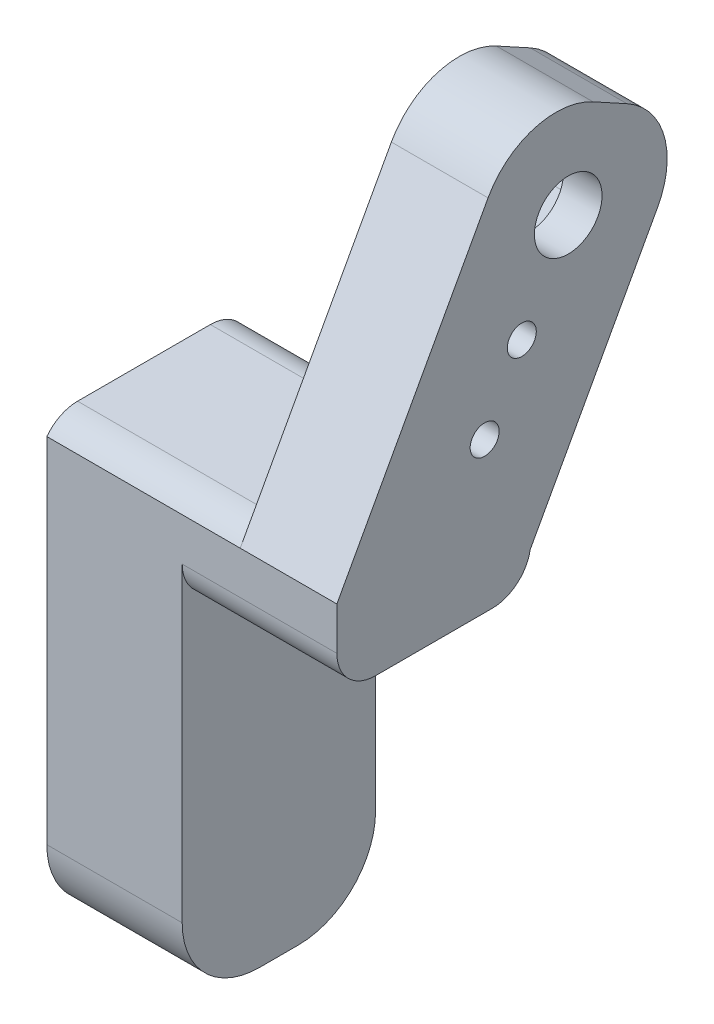
ISO-10303-21;
HEADER;
FILE_DESCRIPTION(('STEP AP214'),'2;1');
FILE_NAME('part.step','',(''),(''),'','','');
FILE_SCHEMA(('AUTOMOTIVE_DESIGN { 1 0 10303 214 1 1 1 1 }'));
ENDSEC;
DATA;
#1=APPLICATION_CONTEXT('core data for automotive mechanical design processes');
#2=APPLICATION_PROTOCOL_DEFINITION('international standard','automotive_design',2000,#1);
#3=PRODUCT_CONTEXT('',#1,'mechanical');
#4=PRODUCT('Part','Part','',(#3));
#5=PRODUCT_RELATED_PRODUCT_CATEGORY('part','',(#4));
#6=PRODUCT_DEFINITION_FORMATION('','',#4);
#7=PRODUCT_DEFINITION_CONTEXT('part definition',#1,'design');
#8=PRODUCT_DEFINITION('design','',#6,#7);
#9=PRODUCT_DEFINITION_SHAPE('','',#8);
#10=(LENGTH_UNIT() NAMED_UNIT(*) SI_UNIT(.MILLI.,.METRE.));
#11=(NAMED_UNIT(*) PLANE_ANGLE_UNIT() SI_UNIT($,.RADIAN.));
#12=(NAMED_UNIT(*) SI_UNIT($,.STERADIAN.) SOLID_ANGLE_UNIT());
#13=UNCERTAINTY_MEASURE_WITH_UNIT(LENGTH_MEASURE(1.E-05),#10,'distance_accuracy_value','');
#14=(GEOMETRIC_REPRESENTATION_CONTEXT(3) GLOBAL_UNCERTAINTY_ASSIGNED_CONTEXT((#13)) GLOBAL_UNIT_ASSIGNED_CONTEXT((#10,
#11,#12)) REPRESENTATION_CONTEXT('',''));
#15=CARTESIAN_POINT('',(0.,0.,0.));
#16=DIRECTION('',(0.,0.,1.));
#17=DIRECTION('',(1.,0.,0.));
#18=AXIS2_PLACEMENT_3D('',#15,#16,#17);
#19=CARTESIAN_POINT('',(15.,-16.6656905459587,14.1244045628382));
#20=DIRECTION('',(0.,0.,-1.));
#21=DIRECTION('',(0.,1.,0.));
#22=AXIS2_PLACEMENT_3D('',#19,#20,#21);
#23=PLANE('',#22);
#24=DIRECTION('',(0.,1.,0.));
#25=VECTOR('',#24,1.);
#26=CARTESIAN_POINT('',(7.,-37.6656905459587,14.1244045628382));
#27=LINE('',#26,#25);
#28=CARTESIAN_POINT('',(7.,-33.6656905459587,14.1244045628382));
#29=VERTEX_POINT('',#28);
#30=CARTESIAN_POINT('',(7.,-17.5988409045163,14.1244045628382));
#31=VERTEX_POINT('',#30);
#32=EDGE_CURVE('E229',#29,#31,#27,.T.);
#33=ORIENTED_EDGE('',*,*,#32,.T.);
#34=DIRECTION('',(1.,0.,0.));
#35=VECTOR('',#34,1.);
#36=CARTESIAN_POINT('',(15.,-17.5988409045163,14.1244045628382));
#37=LINE('',#36,#35);
#38=CARTESIAN_POINT('',(15.,-17.5988409045163,14.1244045628382));
#39=VERTEX_POINT('',#38);
#40=EDGE_CURVE('E335',#31,#39,#37,.T.);
#41=ORIENTED_EDGE('',*,*,#40,.T.);
#42=DIRECTION('',(0.,-1.,0.));
#43=VECTOR('',#42,1.);
#44=CARTESIAN_POINT('',(15.,-16.6656905459587,14.1244045628382));
#45=LINE('',#44,#43);
#46=CARTESIAN_POINT('',(15.,-15.3865334031746,14.1244045628382));
#47=VERTEX_POINT('',#46);
#48=EDGE_CURVE('E251',#47,#39,#45,.T.);
#49=ORIENTED_EDGE('',*,*,#48,.F.);
#50=DIRECTION('',(-1.,0.,0.));
#51=VECTOR('',#50,1.);
#52=CARTESIAN_POINT('',(15.,-15.3865334031746,14.1244045628382));
#53=LINE('',#52,#51);
#54=CARTESIAN_POINT('',(10.,-15.3865334031746,14.1244045628382));
#55=VERTEX_POINT('',#54);
#56=EDGE_CURVE('E273',#47,#55,#53,.T.);
#57=ORIENTED_EDGE('',*,*,#56,.T.);
#58=CARTESIAN_POINT('',(0.,-15.3865334031746,14.1244045628382));
#59=VERTEX_POINT('',#58);
#60=EDGE_CURVE('E263',#55,#59,#53,.T.);
#61=ORIENTED_EDGE('',*,*,#60,.T.);
#62=DIRECTION('',(0.,-1.,0.));
#63=VECTOR('',#62,1.);
#64=CARTESIAN_POINT('',(0.,-16.6656905459587,14.1244045628382));
#65=LINE('',#64,#63);
#66=CARTESIAN_POINT('',(0.,-33.6656905459587,14.1244045628382));
#67=VERTEX_POINT('',#66);
#68=EDGE_CURVE('E250',#59,#67,#65,.T.);
#69=ORIENTED_EDGE('',*,*,#68,.T.);
#70=DIRECTION('',(-1.,0.,0.));
#71=VECTOR('',#70,1.);
#72=CARTESIAN_POINT('',(7.,-33.6656905459587,14.1244045628382));
#73=LINE('',#72,#71);
#74=EDGE_CURVE('E301',#67,#29,#73,.F.);
#75=ORIENTED_EDGE('',*,*,#74,.T.);
#76=EDGE_LOOP('',(#33,#41,#49,#57,#61,#69,#75));
#77=FACE_BOUND('',#76,.T.);
#78=ADVANCED_FACE('F35',(#77),#23,.F.);
#79=CARTESIAN_POINT('',(15.,-37.6656905459587,4.12440456283817));
#80=DIRECTION('',(0.,-1.,0.));
#81=DIRECTION('',(0.,0.,-1.));
#82=AXIS2_PLACEMENT_3D('',#79,#80,#81);
#83=PLANE('',#82);
#84=DIRECTION('',(0.,0.,1.));
#85=VECTOR('',#84,1.);
#86=CARTESIAN_POINT('',(7.,-37.6656905459587,-4.38570803841019));
#87=LINE('',#86,#85);
#88=CARTESIAN_POINT('',(7.,-37.6656905459587,8.12440456283817));
#89=VERTEX_POINT('',#88);
#90=CARTESIAN_POINT('',(7.,-37.6656905459587,10.1244045628382));
#91=VERTEX_POINT('',#90);
#92=EDGE_CURVE('E240',#89,#91,#87,.T.);
#93=ORIENTED_EDGE('',*,*,#92,.T.);
#94=DIRECTION('',(-1.,0.,0.));
#95=VECTOR('',#94,1.);
#96=CARTESIAN_POINT('',(0.,-37.6656905459587,10.1244045628382));
#97=LINE('',#96,#95);
#98=CARTESIAN_POINT('',(0.,-37.6656905459587,10.1244045628382));
#99=VERTEX_POINT('',#98);
#100=EDGE_CURVE('E294',#91,#99,#97,.T.);
#101=ORIENTED_EDGE('',*,*,#100,.T.);
#102=DIRECTION('',(0.,0.,1.));
#103=VECTOR('',#102,1.);
#104=CARTESIAN_POINT('',(0.,-37.6656905459587,4.12440456283817));
#105=LINE('',#104,#103);
#106=CARTESIAN_POINT('',(0.,-37.6656905459587,8.12440456283817));
#107=VERTEX_POINT('',#106);
#108=EDGE_CURVE('E266',#107,#99,#105,.T.);
#109=ORIENTED_EDGE('',*,*,#108,.F.);
#110=DIRECTION('',(-1.,0.,0.));
#111=VECTOR('',#110,1.);
#112=CARTESIAN_POINT('',(15.,-37.6656905459587,8.12440456283817));
#113=LINE('',#112,#111);
#114=EDGE_CURVE('E292',#107,#89,#113,.F.);
#115=ORIENTED_EDGE('',*,*,#114,.T.);
#116=EDGE_LOOP('',(#93,#101,#109,#115));
#117=FACE_BOUND('',#116,.T.);
#118=ADVANCED_FACE('F391',(#117),#83,.T.);
#119=CARTESIAN_POINT('',(15.,-16.6656905459587,4.12440456283817));
#120=DIRECTION('',(0.,0.,-1.));
#121=DIRECTION('',(0.,1.,0.));
#122=AXIS2_PLACEMENT_3D('',#119,#120,#121);
#123=PLANE('',#122);
#124=DIRECTION('',(-1.,0.,0.));
#125=VECTOR('',#124,1.);
#126=CARTESIAN_POINT('',(15.,-17.9448476887428,4.12440456283817));
#127=LINE('',#126,#125);
#128=CARTESIAN_POINT('',(7.,-17.9448476887428,4.12440456283817));
#129=VERTEX_POINT('',#128);
#130=CARTESIAN_POINT('',(0.,-17.9448476887428,4.12440456283817));
#131=VERTEX_POINT('',#130);
#132=EDGE_CURVE('E276',#129,#131,#127,.T.);
#133=ORIENTED_EDGE('',*,*,#132,.F.);
#134=DIRECTION('',(0.,-1.,0.));
#135=VECTOR('',#134,1.);
#136=CARTESIAN_POINT('',(7.,-16.6656905459587,4.12440456283817));
#137=LINE('',#136,#135);
#138=CARTESIAN_POINT('',(7.,-33.6656905459587,4.12440456283817));
#139=VERTEX_POINT('',#138);
#140=EDGE_CURVE('E287',#129,#139,#137,.T.);
#141=ORIENTED_EDGE('',*,*,#140,.T.);
#142=DIRECTION('',(-1.,0.,0.));
#143=VECTOR('',#142,1.);
#144=CARTESIAN_POINT('',(15.,-33.6656905459587,4.12440456283817));
#145=LINE('',#144,#143);
#146=CARTESIAN_POINT('',(0.,-33.6656905459587,4.12440456283817));
#147=VERTEX_POINT('',#146);
#148=EDGE_CURVE('E307',#139,#147,#145,.T.);
#149=ORIENTED_EDGE('',*,*,#148,.T.);
#150=DIRECTION('',(0.,-1.,0.));
#151=VECTOR('',#150,1.);
#152=CARTESIAN_POINT('',(0.,-16.6656905459587,4.12440456283817));
#153=LINE('',#152,#151);
#154=EDGE_CURVE('E269',#131,#147,#153,.T.);
#155=ORIENTED_EDGE('',*,*,#154,.F.);
#156=EDGE_LOOP('',(#133,#141,#149,#155));
#157=FACE_BOUND('',#156,.T.);
#158=ADVANCED_FACE('F385',(#157),#123,.T.);
#159=CARTESIAN_POINT('',(15.,-2.40115909548373,-4.38570803841019));
#160=DIRECTION('',(0.,-0.480231819096746,-0.877141607682038));
#161=DIRECTION('',(0.,0.877141607682038,-0.480231819096746));
#162=AXIS2_PLACEMENT_3D('',#159,#160,#161);
#163=PLANE('',#162);
#164=DIRECTION('',(0.,-0.877141607682038,0.480231819096746));
#165=VECTOR('',#164,1.);
#166=CARTESIAN_POINT('',(0.,-2.40115909548373,-4.38570803841019));
#167=LINE('',#166,#165);
#168=CARTESIAN_POINT('',(0.,-17.5593045427098,3.91332110181182));
#169=VERTEX_POINT('',#168);
#170=EDGE_CURVE('E255',#169,#131,#167,.T.);
#171=ORIENTED_EDGE('',*,*,#170,.F.);
#172=DIRECTION('',(1.,0.,0.));
#173=VECTOR('',#172,1.);
#174=CARTESIAN_POINT('',(15.,-17.5593045427098,3.91332110181182));
#175=LINE('',#174,#173);
#176=CARTESIAN_POINT('',(10.,-17.5593045427098,3.91332110181182));
#177=VERTEX_POINT('',#176);
#178=EDGE_CURVE('E343',#169,#177,#175,.T.);
#179=ORIENTED_EDGE('',*,*,#178,.T.);
#180=DIRECTION('',(0.,0.877141607682038,-0.480231819096746));
#181=VECTOR('',#180,1.);
#182=CARTESIAN_POINT('',(10.,-2.40115909548373,-4.38570803841019));
#183=LINE('',#182,#181);
#184=CARTESIAN_POINT('',(10.,-5.90972552621188,-2.46478076202321));
#185=VERTEX_POINT('',#184);
#186=EDGE_CURVE('E247',#177,#185,#183,.T.);
#187=ORIENTED_EDGE('',*,*,#186,.T.);
#188=DIRECTION('',(-1.,0.,0.));
#189=VECTOR('',#188,1.);
#190=CARTESIAN_POINT('',(15.,-5.90972552621188,-2.46478076202321));
#191=LINE('',#190,#189);
#192=CARTESIAN_POINT('',(15.,-5.90972552621188,-2.46478076202321));
#193=VERTEX_POINT('',#192);
#194=EDGE_CURVE('E319',#185,#193,#191,.F.);
#195=ORIENTED_EDGE('',*,*,#194,.T.);
#196=DIRECTION('',(0.,-0.877141607682038,0.480231819096746));
#197=VECTOR('',#196,1.);
#198=CARTESIAN_POINT('',(15.,-2.40115909548373,-4.38570803841019));
#199=LINE('',#198,#197);
#200=CARTESIAN_POINT('',(15.,-17.9448476887428,4.12440456283817));
#201=VERTEX_POINT('',#200);
#202=EDGE_CURVE('E254',#193,#201,#199,.T.);
#203=ORIENTED_EDGE('',*,*,#202,.T.);
#204=EDGE_CURVE('E277',#201,#129,#127,.T.);
#205=ORIENTED_EDGE('',*,*,#204,.T.);
#206=ORIENTED_EDGE('',*,*,#132,.T.);
#207=EDGE_LOOP('',(#171,#179,#187,#195,#203,#205,#206));
#208=FACE_BOUND('',#207,.T.);
#209=ADVANCED_FACE('F380',(#208),#163,.T.);
#210=CARTESIAN_POINT('',(15.,2.40115909548373,4.38570803841019));
#211=DIRECTION('',(0.,0.877141607682038,-0.480231819096746));
#212=DIRECTION('',(0.,0.480231819096746,0.877141607682038));
#213=AXIS2_PLACEMENT_3D('',#210,#211,#212);
#214=PLANE('',#213);
#215=DIRECTION('',(0.,-0.480231819096746,-0.877141607682038));
#216=VECTOR('',#215,1.);
#217=CARTESIAN_POINT('',(15.,2.40115909548373,4.38570803841019));
#218=LINE('',#217,#216);
#219=CARTESIAN_POINT('',(15.,0.480231819096746,0.877141607682038));
#220=VERTEX_POINT('',#219);
#221=CARTESIAN_POINT('',(15.,-0.480231819096747,-0.87714160768204));
#222=VERTEX_POINT('',#221);
#223=EDGE_CURVE('E258',#220,#222,#218,.T.);
#224=ORIENTED_EDGE('',*,*,#223,.T.);
#225=DIRECTION('',(-1.,0.,0.));
#226=VECTOR('',#225,1.);
#227=CARTESIAN_POINT('',(15.,-0.480231819096746,-0.877141607682038));
#228=LINE('',#227,#226);
#229=CARTESIAN_POINT('',(10.,-0.480231819096746,-0.877141607682038));
#230=VERTEX_POINT('',#229);
#231=EDGE_CURVE('E312',#222,#230,#228,.T.);
#232=ORIENTED_EDGE('',*,*,#231,.T.);
#233=DIRECTION('',(0.,0.480231819096746,0.877141607682038));
#234=VECTOR('',#233,1.);
#235=CARTESIAN_POINT('',(10.,2.40115909548373,4.38570803841019));
#236=LINE('',#235,#234);
#237=CARTESIAN_POINT('',(10.,0.480231819096746,0.877141607682039));
#238=VERTEX_POINT('',#237);
#239=EDGE_CURVE('E239',#230,#238,#236,.T.);
#240=ORIENTED_EDGE('',*,*,#239,.T.);
#241=DIRECTION('',(-1.,0.,0.));
#242=VECTOR('',#241,1.);
#243=CARTESIAN_POINT('',(15.,0.480231819096746,0.877141607682039));
#244=LINE('',#243,#242);
#245=EDGE_CURVE('E310',#238,#220,#244,.F.);
#246=ORIENTED_EDGE('',*,*,#245,.T.);
#247=EDGE_LOOP('',(#224,#232,#240,#246));
#248=FACE_BOUND('',#247,.T.);
#249=ADVANCED_FACE('F460',(#248),#214,.T.);
#250=CARTESIAN_POINT('',(15.,2.40115909548373,4.38570803841019));
#251=DIRECTION('',(0.,-0.480231819096746,-0.877141607682038));
#252=DIRECTION('',(0.,0.877141607682038,-0.480231819096746));
#253=AXIS2_PLACEMENT_3D('',#250,#251,#252);
#254=PLANE('',#253);
#255=DIRECTION('',(0.,0.877141607682038,-0.480231819096746));
#256=VECTOR('',#255,1.);
#257=CARTESIAN_POINT('',(10.,2.40115909548373,4.38570803841019));
#258=LINE('',#257,#256);
#259=CARTESIAN_POINT('',(10.,-1.10740733524442,6.30663531479717));
#260=VERTEX_POINT('',#259);
#261=EDGE_CURVE('E50',#55,#260,#258,.T.);
#262=ORIENTED_EDGE('',*,*,#261,.F.);
#263=ORIENTED_EDGE('',*,*,#56,.F.);
#264=DIRECTION('',(0.,-0.877141607682038,0.480231819096746));
#265=VECTOR('',#264,1.);
#266=CARTESIAN_POINT('',(15.,2.40115909548373,4.38570803841019));
#267=LINE('',#266,#265);
#268=CARTESIAN_POINT('',(15.,-1.10740733524442,6.30663531479717));
#269=VERTEX_POINT('',#268);
#270=EDGE_CURVE('E261',#269,#47,#267,.T.);
#271=ORIENTED_EDGE('',*,*,#270,.F.);
#272=DIRECTION('',(-1.,0.,0.));
#273=VECTOR('',#272,1.);
#274=CARTESIAN_POINT('',(10.,-1.10740733524442,6.30663531479717));
#275=LINE('',#274,#273);
#276=EDGE_CURVE('E325',#269,#260,#275,.T.);
#277=ORIENTED_EDGE('',*,*,#276,.T.);
#278=EDGE_LOOP('',(#262,#263,#271,#277));
#279=FACE_BOUND('',#278,.T.);
#280=ADVANCED_FACE('F464',(#279),#254,.F.);
#281=CARTESIAN_POINT('',(15.,0.,0.));
#282=DIRECTION('',(-1.,0.,0.));
#283=DIRECTION('',(0.,0.,1.));
#284=AXIS2_PLACEMENT_3D('',#281,#282,#283);
#285=PLANE('',#284);
#286=CARTESIAN_POINT('',(15.,-3.94713723456917,2.16104318593536));
#287=DIRECTION('',(-1.,0.,0.));
#288=DIRECTION('',(0.,-1.,0.));
#289=AXIS2_PLACEMENT_3D('',#286,#287,#288);
#290=CIRCLE('',#289,1.75);
#291=CARTESIAN_POINT('',(15.,-5.69713723456917,2.16104318593536));
#292=VERTEX_POINT('',#291);
#293=EDGE_CURVE('E222',#292,#292,#290,.T.);
#294=ORIENTED_EDGE('',*,*,#293,.T.);
#295=EDGE_LOOP('',(#294));
#296=FACE_BOUND('',#295,.T.);
#297=CARTESIAN_POINT('',(15.,-11.8414117037075,6.48312955780607));
#298=DIRECTION('',(-1.,0.,0.));
#299=DIRECTION('',(0.,-1.,0.));
#300=AXIS2_PLACEMENT_3D('',#297,#298,#299);
#301=CIRCLE('',#300,0.750000000000001);
#302=CARTESIAN_POINT('',(15.,-12.5914117037075,6.48312955780607));
#303=VERTEX_POINT('',#302);
#304=EDGE_CURVE('E691',#303,#303,#301,.T.);
#305=ORIENTED_EDGE('',*,*,#304,.T.);
#306=EDGE_LOOP('',(#305));
#307=FACE_BOUND('',#306,.T.);
#308=CARTESIAN_POINT('',(15.,-8.33284527297936,4.56220228141909));
#309=DIRECTION('',(-1.,0.,0.));
#310=DIRECTION('',(0.,-1.,0.));
#311=AXIS2_PLACEMENT_3D('',#308,#309,#310);
#312=CIRCLE('',#311,0.75);
#313=CARTESIAN_POINT('',(15.,-9.08284527297936,4.56220228141909));
#314=VERTEX_POINT('',#313);
#315=EDGE_CURVE('E699',#314,#314,#312,.T.);
#316=ORIENTED_EDGE('',*,*,#315,.T.);
#317=EDGE_LOOP('',(#316));
#318=FACE_BOUND('',#317,.T.);
#319=DIRECTION('',(0.,0.,1.));
#320=VECTOR('',#319,1.);
#321=CARTESIAN_POINT('',(15.,-19.5988409045163,0.));
#322=LINE('',#321,#320);
#323=CARTESIAN_POINT('',(15.,-19.5988409045163,6.09424701980502));
#324=VERTEX_POINT('',#323);
#325=CARTESIAN_POINT('',(15.,-19.5988409045163,12.1244045628382));
#326=VERTEX_POINT('',#325);
#327=EDGE_CURVE('E283',#324,#326,#322,.T.);
#328=ORIENTED_EDGE('',*,*,#327,.F.);
#329=CARTESIAN_POINT('',(15.,-17.5988409045163,6.09424701980502));
#330=DIRECTION('',(-1.,0.,0.));
#331=DIRECTION('',(0.,0.,1.));
#332=AXIS2_PLACEMENT_3D('',#329,#330,#331);
#333=CIRCLE('',#332,2.);
#334=EDGE_CURVE('E333',#324,#201,#333,.F.);
#335=ORIENTED_EDGE('',*,*,#334,.T.);
#336=ORIENTED_EDGE('',*,*,#202,.F.);
#337=CARTESIAN_POINT('',(15.,-3.9887982498249,1.04378566870495));
#338=DIRECTION('',(-1.,0.,0.));
#339=DIRECTION('',(0.,0.,1.));
#340=AXIS2_PLACEMENT_3D('',#337,#338,#339);
#341=CIRCLE('',#340,4.);
#342=EDGE_CURVE('E323',#193,#222,#341,.F.);
#343=ORIENTED_EDGE('',*,*,#342,.T.);
#344=ORIENTED_EDGE('',*,*,#223,.F.);
#345=CARTESIAN_POINT('',(15.,-3.02833461163141,2.79806888406902));
#346=DIRECTION('',(-1.,0.,0.));
#347=DIRECTION('',(0.,0.,1.));
#348=AXIS2_PLACEMENT_3D('',#345,#346,#347);
#349=CIRCLE('',#348,4.);
#350=EDGE_CURVE('E321',#220,#269,#349,.F.);
#351=ORIENTED_EDGE('',*,*,#350,.T.);
#352=ORIENTED_EDGE('',*,*,#270,.T.);
#353=ORIENTED_EDGE('',*,*,#48,.T.);
#354=CARTESIAN_POINT('',(15.,-17.5988409045163,12.1244045628382));
#355=DIRECTION('',(-1.,0.,0.));
#356=DIRECTION('',(0.,0.,1.));
#357=AXIS2_PLACEMENT_3D('',#354,#355,#356);
#358=CIRCLE('',#357,2.);
#359=EDGE_CURVE('E331',#39,#326,#358,.F.);
#360=ORIENTED_EDGE('',*,*,#359,.T.);
#361=EDGE_LOOP('',(#328,#335,#336,#343,#344,#351,#352,#353,#360));
#362=FACE_BOUND('',#361,.T.);
#363=ADVANCED_FACE('F453',(#296,#307,#318,#362),#285,.F.);
#364=CARTESIAN_POINT('',(0.,0.,0.));
#365=DIRECTION('',(-1.,0.,0.));
#366=DIRECTION('',(0.,0.,1.));
#367=AXIS2_PLACEMENT_3D('',#364,#365,#366);
#368=PLANE('',#367);
#369=DIRECTION('',(0.,0.,-1.));
#370=VECTOR('',#369,1.);
#371=CARTESIAN_POINT('',(0.,-14.5988409045163,0.));
#372=LINE('',#371,#370);
#373=CARTESIAN_POINT('',(0.,-14.5988409045163,12.5337095819601));
#374=VERTEX_POINT('',#373);
#375=CARTESIAN_POINT('',(0.,-14.5988409045163,5.6676043171759));
#376=VERTEX_POINT('',#375);
#377=EDGE_CURVE('E280',#374,#376,#372,.T.);
#378=ORIENTED_EDGE('',*,*,#377,.T.);
#379=CARTESIAN_POINT('',(0.,-16.5988409045163,5.6676043171759));
#380=DIRECTION('',(-1.,0.,0.));
#381=DIRECTION('',(0.,0.,1.));
#382=AXIS2_PLACEMENT_3D('',#379,#380,#381);
#383=CIRCLE('',#382,2.);
#384=EDGE_CURVE('E355',#376,#169,#383,.T.);
#385=ORIENTED_EDGE('',*,*,#384,.T.);
#386=ORIENTED_EDGE('',*,*,#170,.T.);
#387=ORIENTED_EDGE('',*,*,#154,.T.);
#388=CARTESIAN_POINT('',(0.,-33.6656905459587,8.12440456283817));
#389=DIRECTION('',(-1.,0.,0.));
#390=DIRECTION('',(0.,0.,1.));
#391=AXIS2_PLACEMENT_3D('',#388,#389,#390);
#392=CIRCLE('',#391,4.);
#393=EDGE_CURVE('E297',#147,#107,#392,.T.);
#394=ORIENTED_EDGE('',*,*,#393,.T.);
#395=ORIENTED_EDGE('',*,*,#108,.T.);
#396=CARTESIAN_POINT('',(0.,-33.6656905459587,10.1244045628382));
#397=DIRECTION('',(-1.,0.,0.));
#398=DIRECTION('',(0.,0.,1.));
#399=AXIS2_PLACEMENT_3D('',#396,#397,#398);
#400=CIRCLE('',#399,4.);
#401=EDGE_CURVE('E299',#99,#67,#400,.T.);
#402=ORIENTED_EDGE('',*,*,#401,.T.);
#403=ORIENTED_EDGE('',*,*,#68,.F.);
#404=CARTESIAN_POINT('',(0.,-16.5988409045163,12.5337095819601));
#405=DIRECTION('',(-1.,0.,0.));
#406=DIRECTION('',(0.,0.,1.));
#407=AXIS2_PLACEMENT_3D('',#404,#405,#406);
#408=CIRCLE('',#407,2.);
#409=EDGE_CURVE('E353',#59,#374,#408,.T.);
#410=ORIENTED_EDGE('',*,*,#409,.T.);
#411=EDGE_LOOP('',(#378,#385,#386,#387,#394,#395,#402,#403,#410));
#412=FACE_BOUND('',#411,.T.);
#413=ADVANCED_FACE('F377',(#412),#368,.T.);
#414=CARTESIAN_POINT('',(10.,-14.5988409045163,-4.38570803841019));
#415=DIRECTION('',(0.,1.,0.));
#416=DIRECTION('',(-1.,0.,0.));
#417=AXIS2_PLACEMENT_3D('',#414,#415,#416);
#418=PLANE('',#417);
#419=DIRECTION('',(0.,0.,1.));
#420=VECTOR('',#419,1.);
#421=CARTESIAN_POINT('',(10.,-14.5988409045163,-4.38570803841019));
#422=LINE('',#421,#420);
#423=CARTESIAN_POINT('',(10.,-14.5988409045163,5.6676043171759));
#424=VERTEX_POINT('',#423);
#425=CARTESIAN_POINT('',(10.,-14.5988409045163,12.5337095819601));
#426=VERTEX_POINT('',#425);
#427=EDGE_CURVE('E235',#424,#426,#422,.T.);
#428=ORIENTED_EDGE('',*,*,#427,.F.);
#429=DIRECTION('',(1.,0.,0.));
#430=VECTOR('',#429,1.);
#431=CARTESIAN_POINT('',(10.,-14.5988409045163,5.6676043171759));
#432=LINE('',#431,#430);
#433=EDGE_CURVE('E351',#424,#376,#432,.F.);
#434=ORIENTED_EDGE('',*,*,#433,.T.);
#435=ORIENTED_EDGE('',*,*,#377,.F.);
#436=DIRECTION('',(-1.,0.,0.));
#437=VECTOR('',#436,1.);
#438=CARTESIAN_POINT('',(10.,-14.5988409045163,12.5337095819601));
#439=LINE('',#438,#437);
#440=EDGE_CURVE('E349',#374,#426,#439,.F.);
#441=ORIENTED_EDGE('',*,*,#440,.T.);
#442=EDGE_LOOP('',(#428,#434,#435,#441));
#443=FACE_BOUND('',#442,.T.);
#444=ADVANCED_FACE('F369',(#443),#418,.T.);
#445=CARTESIAN_POINT('',(10.,2.40115909548373,-4.38570803841019));
#446=DIRECTION('',(-1.,0.,0.));
#447=DIRECTION('',(0.,-1.,0.));
#448=AXIS2_PLACEMENT_3D('',#445,#446,#447);
#449=PLANE('',#448);
#450=ORIENTED_EDGE('',*,*,#239,.F.);
#451=CARTESIAN_POINT('',(10.,-3.9887982498249,1.04378566870495));
#452=DIRECTION('',(-1.,0.,0.));
#453=DIRECTION('',(0.,-1.,0.));
#454=AXIS2_PLACEMENT_3D('',#451,#452,#453);
#455=CIRCLE('',#454,4.);
#456=EDGE_CURVE('E317',#230,#185,#455,.T.);
#457=ORIENTED_EDGE('',*,*,#456,.T.);
#458=ORIENTED_EDGE('',*,*,#186,.F.);
#459=CARTESIAN_POINT('',(10.,-16.5988409045163,5.6676043171759));
#460=DIRECTION('',(-1.,0.,0.));
#461=DIRECTION('',(0.,-1.,0.));
#462=AXIS2_PLACEMENT_3D('',#459,#460,#461);
#463=CIRCLE('',#462,2.);
#464=CARTESIAN_POINT('',(10.,-14.6984001733919,5.04444701160744));
#465=VERTEX_POINT('',#464);
#466=EDGE_CURVE('E357',#177,#465,#463,.F.);
#467=ORIENTED_EDGE('',*,*,#466,.T.);
#468=DIRECTION('',(0.,-0.822138640115904,0.56928732326337));
#469=VECTOR('',#468,1.);
#470=CARTESIAN_POINT('',(10.,-6.0819646968068,-0.921976714499284));
#471=LINE('',#470,#469);
#472=CARTESIAN_POINT('',(10.,-6.0819646968068,-0.921976714499284));
#473=VERTEX_POINT('',#472);
#474=EDGE_CURVE('E223',#473,#465,#471,.T.);
#475=ORIENTED_EDGE('',*,*,#474,.F.);
#476=CARTESIAN_POINT('',(10.,-3.94713723456917,2.16104318593536));
#477=DIRECTION('',(-1.,0.,0.));
#478=DIRECTION('',(0.,-1.,0.));
#479=AXIS2_PLACEMENT_3D('',#476,#477,#478);
#480=CIRCLE('',#479,3.75);
#481=CARTESIAN_POINT('',(10.,-2.49995675472493,5.62054729183808));
#482=VERTEX_POINT('',#481);
#483=EDGE_CURVE('E192',#482,#473,#480,.T.);
#484=ORIENTED_EDGE('',*,*,#483,.F.);
#485=DIRECTION('',(0.,0.922534428240726,-0.38591479462513));
#486=VECTOR('',#485,1.);
#487=CARTESIAN_POINT('',(10.,-12.3401242848385,9.73688822743048));
#488=LINE('',#487,#486);
#489=CARTESIAN_POINT('',(10.,-12.3401242848385,9.73688822743048));
#490=VERTEX_POINT('',#489);
#491=EDGE_CURVE('E209',#490,#482,#488,.T.);
#492=ORIENTED_EDGE('',*,*,#491,.F.);
#493=DIRECTION('',(0.,0.480231819096746,0.877141607682038));
#494=VECTOR('',#493,1.);
#495=CARTESIAN_POINT('',(10.,-14.8893309069767,5.08077193954754));
#496=LINE('',#495,#494);
#497=CARTESIAN_POINT('',(10.,-14.5996756575532,5.60982616096659));
#498=VERTEX_POINT('',#497);
#499=EDGE_CURVE('E290',#498,#490,#496,.T.);
#500=ORIENTED_EDGE('',*,*,#499,.F.);
#501=CARTESIAN_POINT('',(10.,-16.5988409045163,5.6676043171759));
#502=DIRECTION('',(-1.,0.,0.));
#503=DIRECTION('',(0.,-1.,0.));
#504=AXIS2_PLACEMENT_3D('',#501,#502,#503);
#505=CIRCLE('',#504,2.);
#506=EDGE_CURVE('E43',#498,#424,#505,.F.);
#507=ORIENTED_EDGE('',*,*,#506,.T.);
#508=ORIENTED_EDGE('',*,*,#427,.T.);
#509=CARTESIAN_POINT('',(10.,-16.5988409045163,12.5337095819601));
#510=DIRECTION('',(-1.,0.,0.));
#511=DIRECTION('',(0.,-1.,0.));
#512=AXIS2_PLACEMENT_3D('',#509,#510,#511);
#513=CIRCLE('',#512,2.);
#514=EDGE_CURVE('E12',#426,#55,#513,.F.);
#515=ORIENTED_EDGE('',*,*,#514,.T.);
#516=ORIENTED_EDGE('',*,*,#261,.T.);
#517=CARTESIAN_POINT('',(10.,-3.02833461163141,2.79806888406902));
#518=DIRECTION('',(-1.,0.,0.));
#519=DIRECTION('',(0.,-1.,0.));
#520=AXIS2_PLACEMENT_3D('',#517,#518,#519);
#521=CIRCLE('',#520,4.);
#522=EDGE_CURVE('E315',#260,#238,#521,.T.);
#523=ORIENTED_EDGE('',*,*,#522,.T.);
#524=EDGE_LOOP('',(#450,#457,#458,#467,#475,#484,#492,#500,#507,#508,#515,#516,#523));
#525=FACE_BOUND('',#524,.T.);
#526=ADVANCED_FACE('F363',(#525),#449,.T.);
#527=CARTESIAN_POINT('',(7.,-19.5988409045163,-4.38570803841019));
#528=DIRECTION('',(0.,-1.,0.));
#529=DIRECTION('',(0.,0.,-1.));
#530=AXIS2_PLACEMENT_3D('',#527,#528,#529);
#531=PLANE('',#530);
#532=DIRECTION('',(0.,0.,1.));
#533=VECTOR('',#532,1.);
#534=CARTESIAN_POINT('',(7.,-19.5988409045163,-4.38570803841019));
#535=LINE('',#534,#533);
#536=CARTESIAN_POINT('',(7.,-19.5988409045163,6.09424701980502));
#537=VERTEX_POINT('',#536);
#538=CARTESIAN_POINT('',(7.,-19.5988409045163,12.1244045628382));
#539=VERTEX_POINT('',#538);
#540=EDGE_CURVE('E236',#537,#539,#535,.T.);
#541=ORIENTED_EDGE('',*,*,#540,.F.);
#542=DIRECTION('',(1.,0.,0.));
#543=VECTOR('',#542,1.);
#544=CARTESIAN_POINT('',(15.,-19.5988409045163,6.09424701980502));
#545=LINE('',#544,#543);
#546=EDGE_CURVE('E329',#537,#324,#545,.T.);
#547=ORIENTED_EDGE('',*,*,#546,.T.);
#548=ORIENTED_EDGE('',*,*,#327,.T.);
#549=DIRECTION('',(1.,0.,0.));
#550=VECTOR('',#549,1.);
#551=CARTESIAN_POINT('',(7.,-19.5988409045163,12.1244045628382));
#552=LINE('',#551,#550);
#553=EDGE_CURVE('E327',#326,#539,#552,.F.);
#554=ORIENTED_EDGE('',*,*,#553,.T.);
#555=EDGE_LOOP('',(#541,#547,#548,#554));
#556=FACE_BOUND('',#555,.T.);
#557=ADVANCED_FACE('F448',(#556),#531,.T.);
#558=CARTESIAN_POINT('',(7.,-37.6656905459587,-4.38570803841019));
#559=DIRECTION('',(1.,0.,0.));
#560=DIRECTION('',(0.,1.,0.));
#561=AXIS2_PLACEMENT_3D('',#558,#559,#560);
#562=PLANE('',#561);
#563=ORIENTED_EDGE('',*,*,#32,.F.);
#564=CARTESIAN_POINT('',(7.,-33.6656905459587,10.1244045628382));
#565=DIRECTION('',(1.,0.,0.));
#566=DIRECTION('',(0.,1.,0.));
#567=AXIS2_PLACEMENT_3D('',#564,#565,#566);
#568=CIRCLE('',#567,4.);
#569=EDGE_CURVE('E305',#29,#91,#568,.T.);
#570=ORIENTED_EDGE('',*,*,#569,.T.);
#571=ORIENTED_EDGE('',*,*,#92,.F.);
#572=CARTESIAN_POINT('',(7.,-33.6656905459587,8.12440456283817));
#573=DIRECTION('',(1.,0.,0.));
#574=DIRECTION('',(0.,1.,0.));
#575=AXIS2_PLACEMENT_3D('',#572,#573,#574);
#576=CIRCLE('',#575,4.);
#577=EDGE_CURVE('E303',#89,#139,#576,.T.);
#578=ORIENTED_EDGE('',*,*,#577,.T.);
#579=ORIENTED_EDGE('',*,*,#140,.F.);
#580=CARTESIAN_POINT('',(7.,-17.5988409045163,6.09424701980502));
#581=DIRECTION('',(1.,0.,0.));
#582=DIRECTION('',(0.,1.,0.));
#583=AXIS2_PLACEMENT_3D('',#580,#581,#582);
#584=CIRCLE('',#583,2.);
#585=EDGE_CURVE('E338',#129,#537,#584,.F.);
#586=ORIENTED_EDGE('',*,*,#585,.T.);
#587=ORIENTED_EDGE('',*,*,#540,.T.);
#588=CARTESIAN_POINT('',(7.,-17.5988409045163,12.1244045628382));
#589=DIRECTION('',(1.,0.,0.));
#590=DIRECTION('',(0.,1.,0.));
#591=AXIS2_PLACEMENT_3D('',#588,#589,#590);
#592=CIRCLE('',#591,2.);
#593=EDGE_CURVE('E340',#539,#31,#592,.F.);
#594=ORIENTED_EDGE('',*,*,#593,.T.);
#595=EDGE_LOOP('',(#563,#570,#571,#578,#579,#586,#587,#594));
#596=FACE_BOUND('',#595,.T.);
#597=ADVANCED_FACE('F398',(#596),#562,.T.);
#598=CARTESIAN_POINT('',(13.,-3.94713723456917,2.16104318593536));
#599=DIRECTION('',(-1.,0.,0.));
#600=DIRECTION('',(0.,-1.,0.));
#601=AXIS2_PLACEMENT_3D('',#598,#599,#600);
#602=CYLINDRICAL_SURFACE('',#601,3.75);
#603=ORIENTED_EDGE('',*,*,#483,.T.);
#604=DIRECTION('',(-1.,0.,0.));
#605=VECTOR('',#604,1.);
#606=CARTESIAN_POINT('',(13.,-6.0819646968068,-0.921976714499284));
#607=LINE('',#606,#605);
#608=CARTESIAN_POINT('',(13.,-6.0819646968068,-0.921976714499284));
#609=VERTEX_POINT('',#608);
#610=EDGE_CURVE('E185',#609,#473,#607,.T.);
#611=ORIENTED_EDGE('',*,*,#610,.F.);
#612=CARTESIAN_POINT('',(13.,-3.94713723456917,2.16104318593536));
#613=DIRECTION('',(-1.,0.,0.));
#614=DIRECTION('',(0.,-1.,0.));
#615=AXIS2_PLACEMENT_3D('',#612,#613,#614);
#616=CIRCLE('',#615,3.75);
#617=CARTESIAN_POINT('',(13.,-2.49995675472493,5.62054729183808));
#618=VERTEX_POINT('',#617);
#619=EDGE_CURVE('E189',#618,#609,#616,.T.);
#620=ORIENTED_EDGE('',*,*,#619,.F.);
#621=DIRECTION('',(-1.,0.,0.));
#622=VECTOR('',#621,1.);
#623=CARTESIAN_POINT('',(13.,-2.49995675472493,5.62054729183808));
#624=LINE('',#623,#622);
#625=EDGE_CURVE('E227',#618,#482,#624,.T.);
#626=ORIENTED_EDGE('',*,*,#625,.T.);
#627=EDGE_LOOP('',(#603,#611,#620,#626));
#628=FACE_BOUND('',#627,.T.);
#629=ADVANCED_FACE('F187',(#628),#602,.F.);
#630=CARTESIAN_POINT('',(13.,-12.3401242848385,9.73688822743048));
#631=DIRECTION('',(0.,0.38591479462513,0.922534428240726));
#632=DIRECTION('',(0.,-0.922534428240727,0.38591479462513));
#633=AXIS2_PLACEMENT_3D('',#630,#631,#632);
#634=PLANE('',#633);
#635=ORIENTED_EDGE('',*,*,#491,.T.);
#636=ORIENTED_EDGE('',*,*,#625,.F.);
#637=DIRECTION('',(0.,0.922534428240726,-0.38591479462513));
#638=VECTOR('',#637,1.);
#639=CARTESIAN_POINT('',(13.,-12.3401242848385,9.73688822743048));
#640=LINE('',#639,#638);
#641=CARTESIAN_POINT('',(13.,-12.3401242848385,9.73688822743048));
#642=VERTEX_POINT('',#641);
#643=EDGE_CURVE('E196',#642,#618,#640,.T.);
#644=ORIENTED_EDGE('',*,*,#643,.F.);
#645=DIRECTION('',(-1.,0.,0.));
#646=VECTOR('',#645,1.);
#647=CARTESIAN_POINT('',(13.,-12.3401242848385,9.73688822743048));
#648=LINE('',#647,#646);
#649=EDGE_CURVE('E230',#642,#490,#648,.T.);
#650=ORIENTED_EDGE('',*,*,#649,.T.);
#651=EDGE_LOOP('',(#635,#636,#644,#650));
#652=FACE_BOUND('',#651,.T.);
#653=ADVANCED_FACE('F472',(#652),#634,.F.);
#654=CARTESIAN_POINT('',(13.,-14.8512655533047,5.15029816456864));
#655=DIRECTION('',(0.,-0.877141607682038,0.480231819096746));
#656=DIRECTION('',(0.,-0.480231819096746,-0.877141607682038));
#657=AXIS2_PLACEMENT_3D('',#654,#655,#656);
#658=PLANE('',#657);
#659=DIRECTION('',(0.,0.480231819096746,0.877141607682038));
#660=VECTOR('',#659,1.);
#661=CARTESIAN_POINT('',(10.,-14.8512655533047,5.15029816456864));
#662=LINE('',#661,#660);
#663=CARTESIAN_POINT('',(10.,-14.8512655533047,5.15029816456864));
#664=VERTEX_POINT('',#663);
#665=EDGE_CURVE('E212',#664,#498,#662,.T.);
#666=ORIENTED_EDGE('',*,*,#665,.T.);
#667=ORIENTED_EDGE('',*,*,#499,.T.);
#668=ORIENTED_EDGE('',*,*,#649,.F.);
#669=DIRECTION('',(0.,0.480231819096746,0.877141607682038));
#670=VECTOR('',#669,1.);
#671=CARTESIAN_POINT('',(13.,-14.8512655533047,5.15029816456864));
#672=LINE('',#671,#670);
#673=CARTESIAN_POINT('',(13.,-14.8512655533047,5.15029816456864));
#674=VERTEX_POINT('',#673);
#675=EDGE_CURVE('E205',#674,#642,#672,.T.);
#676=ORIENTED_EDGE('',*,*,#675,.F.);
#677=DIRECTION('',(-1.,0.,0.));
#678=VECTOR('',#677,1.);
#679=CARTESIAN_POINT('',(13.,-14.8512655533047,5.15029816456864));
#680=LINE('',#679,#678);
#681=EDGE_CURVE('E195',#674,#664,#680,.T.);
#682=ORIENTED_EDGE('',*,*,#681,.T.);
#683=EDGE_LOOP('',(#666,#667,#668,#676,#682));
#684=FACE_BOUND('',#683,.T.);
#685=ADVANCED_FACE('F470',(#684),#658,.F.);
#686=CARTESIAN_POINT('',(13.,-6.0819646968068,-0.921976714499284));
#687=DIRECTION('',(0.,-0.56928732326337,-0.822138640115904));
#688=DIRECTION('',(0.,0.822138640115904,-0.56928732326337));
#689=AXIS2_PLACEMENT_3D('',#686,#687,#688);
#690=PLANE('',#689);
#691=ORIENTED_EDGE('',*,*,#474,.T.);
#692=EDGE_CURVE('E221',#465,#664,#471,.T.);
#693=ORIENTED_EDGE('',*,*,#692,.T.);
#694=ORIENTED_EDGE('',*,*,#681,.F.);
#695=DIRECTION('',(0.,-0.822138640115904,0.56928732326337));
#696=VECTOR('',#695,1.);
#697=CARTESIAN_POINT('',(13.,-6.0819646968068,-0.921976714499284));
#698=LINE('',#697,#696);
#699=EDGE_CURVE('E199',#609,#674,#698,.T.);
#700=ORIENTED_EDGE('',*,*,#699,.F.);
#701=ORIENTED_EDGE('',*,*,#610,.T.);
#702=EDGE_LOOP('',(#691,#693,#694,#700,#701));
#703=FACE_BOUND('',#702,.T.);
#704=ADVANCED_FACE('F200',(#703),#690,.F.);
#705=CARTESIAN_POINT('',(13.,-3.94713723456917,2.16104318593536));
#706=DIRECTION('',(-1.,0.,0.));
#707=DIRECTION('',(0.,-1.,0.));
#708=AXIS2_PLACEMENT_3D('',#705,#706,#707);
#709=PLANE('',#708);
#710=CARTESIAN_POINT('',(13.,-3.94713723456917,2.16104318593536));
#711=DIRECTION('',(-1.,0.,0.));
#712=DIRECTION('',(0.,-1.,0.));
#713=AXIS2_PLACEMENT_3D('',#710,#711,#712);
#714=CIRCLE('',#713,1.75);
#715=CARTESIAN_POINT('',(13.,-5.69713723456917,2.16104318593536));
#716=VERTEX_POINT('',#715);
#717=EDGE_CURVE('E690',#716,#716,#714,.T.);
#718=ORIENTED_EDGE('',*,*,#717,.F.);
#719=EDGE_LOOP('',(#718));
#720=FACE_BOUND('',#719,.T.);
#721=CARTESIAN_POINT('',(13.,-11.8414117037075,6.48312955780607));
#722=DIRECTION('',(-1.,0.,0.));
#723=DIRECTION('',(0.,-1.,0.));
#724=AXIS2_PLACEMENT_3D('',#721,#722,#723);
#725=CIRCLE('',#724,0.750000000000001);
#726=CARTESIAN_POINT('',(13.,-12.5914117037075,6.48312955780607));
#727=VERTEX_POINT('',#726);
#728=EDGE_CURVE('E695',#727,#727,#725,.T.);
#729=ORIENTED_EDGE('',*,*,#728,.F.);
#730=EDGE_LOOP('',(#729));
#731=FACE_BOUND('',#730,.T.);
#732=CARTESIAN_POINT('',(13.,-8.33284527297936,4.56220228141909));
#733=DIRECTION('',(-1.,0.,0.));
#734=DIRECTION('',(0.,-1.,0.));
#735=AXIS2_PLACEMENT_3D('',#732,#733,#734);
#736=CIRCLE('',#735,0.75);
#737=CARTESIAN_POINT('',(13.,-9.08284527297936,4.56220228141909));
#738=VERTEX_POINT('',#737);
#739=EDGE_CURVE('E215',#738,#738,#736,.T.);
#740=ORIENTED_EDGE('',*,*,#739,.F.);
#741=EDGE_LOOP('',(#740));
#742=FACE_BOUND('',#741,.T.);
#743=ORIENTED_EDGE('',*,*,#619,.T.);
#744=ORIENTED_EDGE('',*,*,#699,.T.);
#745=ORIENTED_EDGE('',*,*,#675,.T.);
#746=ORIENTED_EDGE('',*,*,#643,.T.);
#747=EDGE_LOOP('',(#743,#744,#745,#746));
#748=FACE_BOUND('',#747,.T.);
#749=ADVANCED_FACE('F207',(#720,#731,#742,#748),#709,.T.);
#750=CARTESIAN_POINT('',(10.,-3.94713723456917,2.16104318593536));
#751=DIRECTION('',(-1.,0.,0.));
#752=DIRECTION('',(0.,-1.,0.));
#753=AXIS2_PLACEMENT_3D('',#750,#751,#752);
#754=PLANE('',#753);
#755=ORIENTED_EDGE('',*,*,#692,.F.);
#756=CARTESIAN_POINT('',(10.,-16.5988409045163,5.6676043171759));
#757=DIRECTION('',(-1.,0.,0.));
#758=DIRECTION('',(0.,-1.,0.));
#759=AXIS2_PLACEMENT_3D('',#756,#757,#758);
#760=CIRCLE('',#759,2.);
#761=EDGE_CURVE('E346',#465,#498,#760,.F.);
#762=ORIENTED_EDGE('',*,*,#761,.T.);
#763=ORIENTED_EDGE('',*,*,#665,.F.);
#764=EDGE_LOOP('',(#755,#762,#763));
#765=FACE_BOUND('',#764,.T.);
#766=ADVANCED_FACE('F468',(#765),#754,.F.);
#767=CARTESIAN_POINT('',(15.,-8.33284527297936,4.56220228141909));
#768=DIRECTION('',(-1.,0.,0.));
#769=DIRECTION('',(0.,-1.,0.));
#770=AXIS2_PLACEMENT_3D('',#767,#768,#769);
#771=CYLINDRICAL_SURFACE('',#770,0.75);
#772=ORIENTED_EDGE('',*,*,#315,.F.);
#773=EDGE_LOOP('',(#772));
#774=FACE_BOUND('',#773,.T.);
#775=ORIENTED_EDGE('',*,*,#739,.T.);
#776=EDGE_LOOP('',(#775));
#777=FACE_BOUND('',#776,.T.);
#778=ADVANCED_FACE('F574',(#774,#777),#771,.F.);
#779=CARTESIAN_POINT('',(15.,-11.8414117037075,6.48312955780607));
#780=DIRECTION('',(-1.,0.,0.));
#781=DIRECTION('',(0.,-1.,0.));
#782=AXIS2_PLACEMENT_3D('',#779,#780,#781);
#783=CYLINDRICAL_SURFACE('',#782,0.750000000000001);
#784=ORIENTED_EDGE('',*,*,#304,.F.);
#785=EDGE_LOOP('',(#784));
#786=FACE_BOUND('',#785,.T.);
#787=ORIENTED_EDGE('',*,*,#728,.T.);
#788=EDGE_LOOP('',(#787));
#789=FACE_BOUND('',#788,.T.);
#790=ADVANCED_FACE('F579',(#786,#789),#783,.F.);
#791=CARTESIAN_POINT('',(15.,-3.94713723456917,2.16104318593536));
#792=DIRECTION('',(-1.,0.,0.));
#793=DIRECTION('',(0.,-1.,0.));
#794=AXIS2_PLACEMENT_3D('',#791,#792,#793);
#795=CYLINDRICAL_SURFACE('',#794,1.75);
#796=ORIENTED_EDGE('',*,*,#293,.F.);
#797=EDGE_LOOP('',(#796));
#798=FACE_BOUND('',#797,.T.);
#799=ORIENTED_EDGE('',*,*,#717,.T.);
#800=EDGE_LOOP('',(#799));
#801=FACE_BOUND('',#800,.T.);
#802=ADVANCED_FACE('F423',(#798,#801),#795,.F.);
#803=CARTESIAN_POINT('',(15.,-33.6656905459587,10.1244045628382));
#804=DIRECTION('',(1.,0.,0.));
#805=DIRECTION('',(0.,0.,-1.));
#806=AXIS2_PLACEMENT_3D('',#803,#804,#805);
#807=CYLINDRICAL_SURFACE('',#806,4.);
#808=ORIENTED_EDGE('',*,*,#569,.F.);
#809=ORIENTED_EDGE('',*,*,#74,.F.);
#810=ORIENTED_EDGE('',*,*,#401,.F.);
#811=ORIENTED_EDGE('',*,*,#100,.F.);
#812=EDGE_LOOP('',(#808,#809,#810,#811));
#813=FACE_BOUND('',#812,.T.);
#814=ADVANCED_FACE('F402',(#813),#807,.T.);
#815=CARTESIAN_POINT('',(15.,-33.6656905459587,8.12440456283817));
#816=DIRECTION('',(-1.,0.,0.));
#817=DIRECTION('',(0.,0.,1.));
#818=AXIS2_PLACEMENT_3D('',#815,#816,#817);
#819=CYLINDRICAL_SURFACE('',#818,4.);
#820=ORIENTED_EDGE('',*,*,#577,.F.);
#821=ORIENTED_EDGE('',*,*,#114,.F.);
#822=ORIENTED_EDGE('',*,*,#393,.F.);
#823=ORIENTED_EDGE('',*,*,#148,.F.);
#824=EDGE_LOOP('',(#820,#821,#822,#823));
#825=FACE_BOUND('',#824,.T.);
#826=ADVANCED_FACE('F395',(#825),#819,.T.);
#827=CARTESIAN_POINT('',(15.,-3.9887982498249,1.04378566870495));
#828=DIRECTION('',(-1.,0.,0.));
#829=DIRECTION('',(0.,0.,1.));
#830=AXIS2_PLACEMENT_3D('',#827,#828,#829);
#831=CYLINDRICAL_SURFACE('',#830,4.);
#832=ORIENTED_EDGE('',*,*,#342,.F.);
#833=ORIENTED_EDGE('',*,*,#194,.F.);
#834=ORIENTED_EDGE('',*,*,#456,.F.);
#835=ORIENTED_EDGE('',*,*,#231,.F.);
#836=EDGE_LOOP('',(#832,#833,#834,#835));
#837=FACE_BOUND('',#836,.T.);
#838=ADVANCED_FACE('F426',(#837),#831,.T.);
#839=CARTESIAN_POINT('',(15.,-3.02833461163141,2.79806888406902));
#840=DIRECTION('',(1.,0.,0.));
#841=DIRECTION('',(0.,0.,-1.));
#842=AXIS2_PLACEMENT_3D('',#839,#840,#841);
#843=CYLINDRICAL_SURFACE('',#842,4.);
#844=ORIENTED_EDGE('',*,*,#350,.F.);
#845=ORIENTED_EDGE('',*,*,#245,.F.);
#846=ORIENTED_EDGE('',*,*,#522,.F.);
#847=ORIENTED_EDGE('',*,*,#276,.F.);
#848=EDGE_LOOP('',(#844,#845,#846,#847));
#849=FACE_BOUND('',#848,.T.);
#850=ADVANCED_FACE('F429',(#849),#843,.T.);
#851=CARTESIAN_POINT('',(15.,-17.5988409045163,6.09424701980502));
#852=DIRECTION('',(-1.,0.,0.));
#853=DIRECTION('',(0.,0.,1.));
#854=AXIS2_PLACEMENT_3D('',#851,#852,#853);
#855=CYLINDRICAL_SURFACE('',#854,2.);
#856=ORIENTED_EDGE('',*,*,#334,.F.);
#857=ORIENTED_EDGE('',*,*,#546,.F.);
#858=ORIENTED_EDGE('',*,*,#585,.F.);
#859=ORIENTED_EDGE('',*,*,#204,.F.);
#860=EDGE_LOOP('',(#856,#857,#858,#859));
#861=FACE_BOUND('',#860,.T.);
#862=ADVANCED_FACE('F433',(#861),#855,.T.);
#863=CARTESIAN_POINT('',(15.,-17.5988409045163,12.1244045628382));
#864=DIRECTION('',(-1.,0.,0.));
#865=DIRECTION('',(0.,0.,1.));
#866=AXIS2_PLACEMENT_3D('',#863,#864,#865);
#867=CYLINDRICAL_SURFACE('',#866,2.);
#868=ORIENTED_EDGE('',*,*,#593,.F.);
#869=ORIENTED_EDGE('',*,*,#553,.F.);
#870=ORIENTED_EDGE('',*,*,#359,.F.);
#871=ORIENTED_EDGE('',*,*,#40,.F.);
#872=EDGE_LOOP('',(#868,#869,#870,#871));
#873=FACE_BOUND('',#872,.T.);
#874=ADVANCED_FACE('F412',(#873),#867,.T.);
#875=CARTESIAN_POINT('',(15.,-16.5988409045163,5.6676043171759));
#876=DIRECTION('',(1.,0.,0.));
#877=DIRECTION('',(0.,1.,0.));
#878=AXIS2_PLACEMENT_3D('',#875,#876,#877);
#879=CYLINDRICAL_SURFACE('',#878,2.);
#880=ORIENTED_EDGE('',*,*,#384,.F.);
#881=ORIENTED_EDGE('',*,*,#433,.F.);
#882=ORIENTED_EDGE('',*,*,#506,.F.);
#883=ORIENTED_EDGE('',*,*,#761,.F.);
#884=ORIENTED_EDGE('',*,*,#466,.F.);
#885=ORIENTED_EDGE('',*,*,#178,.F.);
#886=EDGE_LOOP('',(#880,#881,#882,#883,#884,#885));
#887=FACE_BOUND('',#886,.T.);
#888=ADVANCED_FACE('F372',(#887),#879,.T.);
#889=CARTESIAN_POINT('',(15.,-16.5988409045163,12.5337095819601));
#890=DIRECTION('',(1.,0.,0.));
#891=DIRECTION('',(0.,0.,-1.));
#892=AXIS2_PLACEMENT_3D('',#889,#890,#891);
#893=CYLINDRICAL_SURFACE('',#892,2.);
#894=ORIENTED_EDGE('',*,*,#409,.F.);
#895=ORIENTED_EDGE('',*,*,#60,.F.);
#896=ORIENTED_EDGE('',*,*,#514,.F.);
#897=ORIENTED_EDGE('',*,*,#440,.F.);
#898=EDGE_LOOP('',(#894,#895,#896,#897));
#899=FACE_BOUND('',#898,.T.);
#900=ADVANCED_FACE('F37',(#899),#893,.T.);
#901=CLOSED_SHELL('',(#78,#118,#158,#209,#249,#280,#363,#413,#444,#526,#557,#597,#629,#653,#685,
#704,#749,#766,#778,#790,#802,#814,#826,#838,#850,#862,#874,#888,#900));
#902=MANIFOLD_SOLID_BREP('B2',#901);
#903=ADVANCED_BREP_SHAPE_REPRESENTATION('',(#18,#902),#14);
#904=SHAPE_DEFINITION_REPRESENTATION(#9,#903);
ENDSEC;
END-ISO-10303-21;
